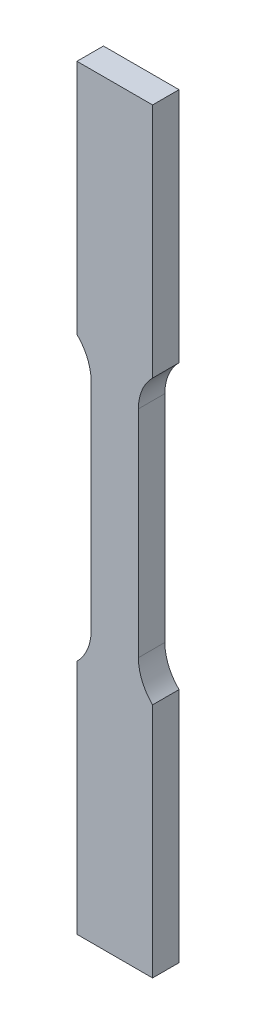
ISO-10303-21;
HEADER;
FILE_DESCRIPTION(('STEP AP214'),'2;1');
FILE_NAME('part.step','',(''),(''),'','','');
FILE_SCHEMA(('AUTOMOTIVE_DESIGN { 1 0 10303 214 1 1 1 1 }'));
ENDSEC;
DATA;
#1=APPLICATION_CONTEXT('core data for automotive mechanical design processes');
#2=APPLICATION_PROTOCOL_DEFINITION('international standard','automotive_design',2000,#1);
#3=PRODUCT_CONTEXT('',#1,'mechanical');
#4=PRODUCT('Part','Part','',(#3));
#5=PRODUCT_RELATED_PRODUCT_CATEGORY('part','',(#4));
#6=PRODUCT_DEFINITION_FORMATION('','',#4);
#7=PRODUCT_DEFINITION_CONTEXT('part definition',#1,'design');
#8=PRODUCT_DEFINITION('design','',#6,#7);
#9=PRODUCT_DEFINITION_SHAPE('','',#8);
#10=(LENGTH_UNIT() NAMED_UNIT(*) SI_UNIT(.MILLI.,.METRE.));
#11=(NAMED_UNIT(*) PLANE_ANGLE_UNIT() SI_UNIT($,.RADIAN.));
#12=(NAMED_UNIT(*) SI_UNIT($,.STERADIAN.) SOLID_ANGLE_UNIT());
#13=UNCERTAINTY_MEASURE_WITH_UNIT(LENGTH_MEASURE(1.E-05),#10,'distance_accuracy_value','');
#14=(GEOMETRIC_REPRESENTATION_CONTEXT(3) GLOBAL_UNCERTAINTY_ASSIGNED_CONTEXT((#13)) GLOBAL_UNIT_ASSIGNED_CONTEXT((#10,
#11,#12)) REPRESENTATION_CONTEXT('',''));
#15=CARTESIAN_POINT('',(0.,0.,0.));
#16=DIRECTION('',(0.,0.,1.));
#17=DIRECTION('',(1.,0.,0.));
#18=AXIS2_PLACEMENT_3D('',#15,#16,#17);
#19=CARTESIAN_POINT('',(0.,0.,3.499999985));
#20=DIRECTION('',(0.,0.,-1.));
#21=DIRECTION('',(-1.,0.,0.));
#22=AXIS2_PLACEMENT_3D('',#19,#20,#21);
#23=PLANE('',#22);
#24=CARTESIAN_POINT('',(18.7499998379998,-28.5000000230001,3.499999985));
#25=DIRECTION('',(0.,0.,1.));
#26=DIRECTION('',(1.,0.,0.));
#27=AXIS2_PLACEMENT_3D('',#24,#25,#26);
#28=CIRCLE('',#27,12.499999892);
#29=CARTESIAN_POINT('',(9.999999939,-37.4267855064484,3.499999985));
#30=VERTEX_POINT('',#29);
#31=CARTESIAN_POINT('',(6.24999994599992,-28.500000023,3.499999985));
#32=VERTEX_POINT('',#31);
#33=EDGE_CURVE('E190',#30,#32,#28,.F.);
#34=ORIENTED_EDGE('',*,*,#33,.T.);
#35=DIRECTION('',(0.,1.,0.));
#36=VECTOR('',#35,1.);
#37=CARTESIAN_POINT('',(6.249999946,0.,3.499999985));
#38=LINE('',#37,#36);
#39=CARTESIAN_POINT('',(6.249999946,28.500000023,3.499999985));
#40=VERTEX_POINT('',#39);
#41=EDGE_CURVE('E137',#32,#40,#38,.T.);
#42=ORIENTED_EDGE('',*,*,#41,.T.);
#43=CARTESIAN_POINT('',(18.749999838,28.500000023,3.499999985));
#44=DIRECTION('',(0.,0.,1.));
#45=DIRECTION('',(1.,0.,0.));
#46=AXIS2_PLACEMENT_3D('',#43,#44,#45);
#47=CIRCLE('',#46,12.499999892);
#48=CARTESIAN_POINT('',(9.999999939,37.4267855064481,3.499999985));
#49=VERTEX_POINT('',#48);
#50=EDGE_CURVE('E125',#49,#40,#47,.T.);
#51=ORIENTED_EDGE('',*,*,#50,.F.);
#52=DIRECTION('',(0.,1.,0.));
#53=VECTOR('',#52,1.);
#54=CARTESIAN_POINT('',(9.999999939,-100.000000025,3.499999985));
#55=LINE('',#54,#53);
#56=CARTESIAN_POINT('',(9.999999939,100.000000025,3.499999985));
#57=VERTEX_POINT('',#56);
#58=EDGE_CURVE('E134',#49,#57,#55,.T.);
#59=ORIENTED_EDGE('',*,*,#58,.T.);
#60=DIRECTION('',(-1.,0.,0.));
#61=VECTOR('',#60,1.);
#62=CARTESIAN_POINT('',(-9.999999939,100.000000025,3.499999985));
#63=LINE('',#62,#61);
#64=CARTESIAN_POINT('',(-9.999999939,100.000000025,3.499999985));
#65=VERTEX_POINT('',#64);
#66=EDGE_CURVE('E146',#57,#65,#63,.T.);
#67=ORIENTED_EDGE('',*,*,#66,.T.);
#68=DIRECTION('',(0.,-1.,0.));
#69=VECTOR('',#68,1.);
#70=CARTESIAN_POINT('',(-9.999999939,-100.000000025,3.499999985));
#71=LINE('',#70,#69);
#72=CARTESIAN_POINT('',(-9.999999939,37.426785506448,3.499999985));
#73=VERTEX_POINT('',#72);
#74=EDGE_CURVE('E155',#65,#73,#71,.T.);
#75=ORIENTED_EDGE('',*,*,#74,.T.);
#76=CARTESIAN_POINT('',(-18.749999838,28.5000000229999,3.499999985));
#77=DIRECTION('',(0.,0.,1.));
#78=DIRECTION('',(1.,0.,0.));
#79=AXIS2_PLACEMENT_3D('',#76,#77,#78);
#80=CIRCLE('',#79,12.499999892);
#81=CARTESIAN_POINT('',(-6.24999994599999,28.500000023,3.499999985));
#82=VERTEX_POINT('',#81);
#83=EDGE_CURVE('E197',#73,#82,#80,.F.);
#84=ORIENTED_EDGE('',*,*,#83,.T.);
#85=DIRECTION('',(0.,1.,0.));
#86=VECTOR('',#85,1.);
#87=CARTESIAN_POINT('',(-6.249999946,0.,3.499999985));
#88=LINE('',#87,#86);
#89=CARTESIAN_POINT('',(-6.24999994599992,-28.500000023,3.499999985));
#90=VERTEX_POINT('',#89);
#91=EDGE_CURVE('E217',#90,#82,#88,.T.);
#92=ORIENTED_EDGE('',*,*,#91,.F.);
#93=CARTESIAN_POINT('',(-18.7499998379998,-28.5000000230002,3.499999985));
#94=DIRECTION('',(0.,0.,1.));
#95=DIRECTION('',(1.,0.,0.));
#96=AXIS2_PLACEMENT_3D('',#93,#94,#95);
#97=CIRCLE('',#96,12.499999892);
#98=CARTESIAN_POINT('',(-9.999999939,-37.4267855064484,3.499999985));
#99=VERTEX_POINT('',#98);
#100=EDGE_CURVE('E222',#99,#90,#97,.T.);
#101=ORIENTED_EDGE('',*,*,#100,.F.);
#102=CARTESIAN_POINT('',(-9.999999939,-100.000000025,3.499999985));
#103=VERTEX_POINT('',#102);
#104=EDGE_CURVE('E154',#99,#103,#71,.T.);
#105=ORIENTED_EDGE('',*,*,#104,.T.);
#106=DIRECTION('',(1.,0.,0.));
#107=VECTOR('',#106,1.);
#108=CARTESIAN_POINT('',(-9.999999939,-100.000000025,3.499999985));
#109=LINE('',#108,#107);
#110=CARTESIAN_POINT('',(9.999999939,-100.000000025,3.499999985));
#111=VERTEX_POINT('',#110);
#112=EDGE_CURVE('E158',#103,#111,#109,.T.);
#113=ORIENTED_EDGE('',*,*,#112,.T.);
#114=EDGE_CURVE('E142',#111,#30,#55,.T.);
#115=ORIENTED_EDGE('',*,*,#114,.T.);
#116=EDGE_LOOP('',(#34,#42,#51,#59,#67,#75,#84,#92,#101,#105,#113,#115));
#117=FACE_BOUND('',#116,.T.);
#118=ADVANCED_FACE('F34',(#117),#23,.F.);
#119=CARTESIAN_POINT('',(0.,0.,-3.499999985));
#120=DIRECTION('',(0.,0.,-1.));
#121=DIRECTION('',(-1.,0.,0.));
#122=AXIS2_PLACEMENT_3D('',#119,#120,#121);
#123=PLANE('',#122);
#124=DIRECTION('',(0.,-1.,0.));
#125=VECTOR('',#124,1.);
#126=CARTESIAN_POINT('',(6.249999946,0.,-3.499999985));
#127=LINE('',#126,#125);
#128=CARTESIAN_POINT('',(6.249999946,28.500000023,-3.499999985));
#129=VERTEX_POINT('',#128);
#130=CARTESIAN_POINT('',(6.24999994599992,-28.500000023,-3.499999985));
#131=VERTEX_POINT('',#130);
#132=EDGE_CURVE('E11',#129,#131,#127,.T.);
#133=ORIENTED_EDGE('',*,*,#132,.T.);
#134=CARTESIAN_POINT('',(18.7499998379998,-28.5000000230001,-3.499999985));
#135=DIRECTION('',(0.,0.,-1.));
#136=DIRECTION('',(-1.,0.,0.));
#137=AXIS2_PLACEMENT_3D('',#134,#135,#136);
#138=CIRCLE('',#137,12.499999892);
#139=CARTESIAN_POINT('',(9.999999939,-37.4267855064484,-3.499999985));
#140=VERTEX_POINT('',#139);
#141=EDGE_CURVE('E188',#131,#140,#138,.F.);
#142=ORIENTED_EDGE('',*,*,#141,.T.);
#143=DIRECTION('',(0.,1.,0.));
#144=VECTOR('',#143,1.);
#145=CARTESIAN_POINT('',(9.999999939,-100.000000025,-3.499999985));
#146=LINE('',#145,#144);
#147=CARTESIAN_POINT('',(9.999999939,-100.000000025,-3.499999985));
#148=VERTEX_POINT('',#147);
#149=EDGE_CURVE('E161',#148,#140,#146,.T.);
#150=ORIENTED_EDGE('',*,*,#149,.F.);
#151=DIRECTION('',(1.,0.,0.));
#152=VECTOR('',#151,1.);
#153=CARTESIAN_POINT('',(-9.999999939,-100.000000025,-3.499999985));
#154=LINE('',#153,#152);
#155=CARTESIAN_POINT('',(-9.999999939,-100.000000025,-3.499999985));
#156=VERTEX_POINT('',#155);
#157=EDGE_CURVE('E143',#156,#148,#154,.T.);
#158=ORIENTED_EDGE('',*,*,#157,.F.);
#159=DIRECTION('',(0.,-1.,0.));
#160=VECTOR('',#159,1.);
#161=CARTESIAN_POINT('',(-9.999999939,-100.000000025,-3.499999985));
#162=LINE('',#161,#160);
#163=CARTESIAN_POINT('',(-9.999999939,-37.4267855064484,-3.499999985));
#164=VERTEX_POINT('',#163);
#165=EDGE_CURVE('E167',#164,#156,#162,.T.);
#166=ORIENTED_EDGE('',*,*,#165,.F.);
#167=CARTESIAN_POINT('',(-18.7499998379998,-28.5000000230002,-3.499999985));
#168=DIRECTION('',(0.,0.,-1.));
#169=DIRECTION('',(-1.,0.,0.));
#170=AXIS2_PLACEMENT_3D('',#167,#168,#169);
#171=CIRCLE('',#170,12.499999892);
#172=CARTESIAN_POINT('',(-6.24999994599983,-28.500000023,-3.499999985));
#173=VERTEX_POINT('',#172);
#174=EDGE_CURVE('E179',#173,#164,#171,.T.);
#175=ORIENTED_EDGE('',*,*,#174,.F.);
#176=DIRECTION('',(0.,-1.,0.));
#177=VECTOR('',#176,1.);
#178=CARTESIAN_POINT('',(-6.249999946,0.,-3.499999985));
#179=LINE('',#178,#177);
#180=CARTESIAN_POINT('',(-6.24999994599999,28.500000023,-3.499999985));
#181=VERTEX_POINT('',#180);
#182=EDGE_CURVE('E181',#181,#173,#179,.T.);
#183=ORIENTED_EDGE('',*,*,#182,.F.);
#184=CARTESIAN_POINT('',(-18.749999838,28.5000000229999,-3.499999985));
#185=DIRECTION('',(0.,0.,-1.));
#186=DIRECTION('',(-1.,0.,0.));
#187=AXIS2_PLACEMENT_3D('',#184,#185,#186);
#188=CIRCLE('',#187,12.499999892);
#189=CARTESIAN_POINT('',(-9.999999939,37.426785506448,-3.499999985));
#190=VERTEX_POINT('',#189);
#191=EDGE_CURVE('E130',#181,#190,#188,.F.);
#192=ORIENTED_EDGE('',*,*,#191,.T.);
#193=CARTESIAN_POINT('',(-9.999999939,100.000000025,-3.499999985));
#194=VERTEX_POINT('',#193);
#195=EDGE_CURVE('E147',#194,#190,#162,.T.);
#196=ORIENTED_EDGE('',*,*,#195,.F.);
#197=DIRECTION('',(-1.,0.,0.));
#198=VECTOR('',#197,1.);
#199=CARTESIAN_POINT('',(-9.999999939,100.000000025,-3.499999985));
#200=LINE('',#199,#198);
#201=CARTESIAN_POINT('',(9.999999939,100.000000025,-3.499999985));
#202=VERTEX_POINT('',#201);
#203=EDGE_CURVE('E164',#202,#194,#200,.T.);
#204=ORIENTED_EDGE('',*,*,#203,.F.);
#205=CARTESIAN_POINT('',(9.999999939,37.4267855064481,-3.499999985));
#206=VERTEX_POINT('',#205);
#207=EDGE_CURVE('E165',#206,#202,#146,.T.);
#208=ORIENTED_EDGE('',*,*,#207,.F.);
#209=CARTESIAN_POINT('',(18.749999838,28.500000023,-3.499999985));
#210=DIRECTION('',(0.,0.,-1.));
#211=DIRECTION('',(-1.,0.,0.));
#212=AXIS2_PLACEMENT_3D('',#209,#210,#211);
#213=CIRCLE('',#212,12.499999892);
#214=EDGE_CURVE('E49',#129,#206,#213,.T.);
#215=ORIENTED_EDGE('',*,*,#214,.F.);
#216=EDGE_LOOP('',(#133,#142,#150,#158,#166,#175,#183,#192,#196,#204,#208,#215));
#217=FACE_BOUND('',#216,.T.);
#218=ADVANCED_FACE('F195',(#217),#123,.T.);
#219=CARTESIAN_POINT('',(9.999999939,-100.000000025,3.499999985));
#220=DIRECTION('',(-1.,0.,0.));
#221=DIRECTION('',(0.,0.,1.));
#222=AXIS2_PLACEMENT_3D('',#219,#220,#221);
#223=PLANE('',#222);
#224=DIRECTION('',(0.,0.,1.));
#225=VECTOR('',#224,1.);
#226=CARTESIAN_POINT('',(9.99999993900001,-37.4267855064484,-3.612000015));
#227=LINE('',#226,#225);
#228=EDGE_CURVE('E42',#30,#140,#227,.F.);
#229=ORIENTED_EDGE('',*,*,#228,.F.);
#230=ORIENTED_EDGE('',*,*,#114,.F.);
#231=DIRECTION('',(0.,0.,-1.));
#232=VECTOR('',#231,1.);
#233=CARTESIAN_POINT('',(9.999999939,-100.000000025,3.499999985));
#234=LINE('',#233,#232);
#235=EDGE_CURVE('E160',#111,#148,#234,.T.);
#236=ORIENTED_EDGE('',*,*,#235,.T.);
#237=ORIENTED_EDGE('',*,*,#149,.T.);
#238=EDGE_LOOP('',(#229,#230,#236,#237));
#239=FACE_BOUND('',#238,.T.);
#240=ADVANCED_FACE('F199',(#239),#223,.F.);
#241=CARTESIAN_POINT('',(-9.999999939,-100.000000025,3.499999985));
#242=DIRECTION('',(1.,0.,0.));
#243=DIRECTION('',(0.,0.,-1.));
#244=AXIS2_PLACEMENT_3D('',#241,#242,#243);
#245=PLANE('',#244);
#246=DIRECTION('',(0.,0.,1.));
#247=VECTOR('',#246,1.);
#248=CARTESIAN_POINT('',(-9.999999939,37.426785506448,-3.612000015));
#249=LINE('',#248,#247);
#250=EDGE_CURVE('E151',#190,#73,#249,.T.);
#251=ORIENTED_EDGE('',*,*,#250,.T.);
#252=ORIENTED_EDGE('',*,*,#74,.F.);
#253=DIRECTION('',(0.,0.,-1.));
#254=VECTOR('',#253,1.);
#255=CARTESIAN_POINT('',(-9.999999939,100.000000025,3.499999985));
#256=LINE('',#255,#254);
#257=EDGE_CURVE('E175',#65,#194,#256,.T.);
#258=ORIENTED_EDGE('',*,*,#257,.T.);
#259=ORIENTED_EDGE('',*,*,#195,.T.);
#260=EDGE_LOOP('',(#251,#252,#258,#259));
#261=FACE_BOUND('',#260,.T.);
#262=ADVANCED_FACE('F258',(#261),#245,.F.);
#263=ORIENTED_EDGE('',*,*,#58,.F.);
#264=DIRECTION('',(0.,0.,1.));
#265=VECTOR('',#264,1.);
#266=CARTESIAN_POINT('',(9.99999993900001,37.4267855064481,-3.612000015));
#267=LINE('',#266,#265);
#268=EDGE_CURVE('E122',#49,#206,#267,.F.);
#269=ORIENTED_EDGE('',*,*,#268,.T.);
#270=ORIENTED_EDGE('',*,*,#207,.T.);
#271=DIRECTION('',(0.,0.,-1.));
#272=VECTOR('',#271,1.);
#273=CARTESIAN_POINT('',(9.999999939,100.000000025,3.499999985));
#274=LINE('',#273,#272);
#275=EDGE_CURVE('E141',#57,#202,#274,.T.);
#276=ORIENTED_EDGE('',*,*,#275,.F.);
#277=EDGE_LOOP('',(#263,#269,#270,#276));
#278=FACE_BOUND('',#277,.T.);
#279=ADVANCED_FACE('F36',(#278),#223,.F.);
#280=CARTESIAN_POINT('',(-9.999999939,100.000000025,3.499999985));
#281=DIRECTION('',(0.,-1.,0.));
#282=DIRECTION('',(0.,0.,-1.));
#283=AXIS2_PLACEMENT_3D('',#280,#281,#282);
#284=PLANE('',#283);
#285=ORIENTED_EDGE('',*,*,#203,.T.);
#286=ORIENTED_EDGE('',*,*,#257,.F.);
#287=ORIENTED_EDGE('',*,*,#66,.F.);
#288=ORIENTED_EDGE('',*,*,#275,.T.);
#289=EDGE_LOOP('',(#285,#286,#287,#288));
#290=FACE_BOUND('',#289,.T.);
#291=ADVANCED_FACE('F257',(#290),#284,.F.);
#292=ORIENTED_EDGE('',*,*,#104,.F.);
#293=DIRECTION('',(0.,0.,1.));
#294=VECTOR('',#293,1.);
#295=CARTESIAN_POINT('',(-9.999999939,-37.4267855064484,-3.612000015));
#296=LINE('',#295,#294);
#297=EDGE_CURVE('E212',#164,#99,#296,.T.);
#298=ORIENTED_EDGE('',*,*,#297,.F.);
#299=ORIENTED_EDGE('',*,*,#165,.T.);
#300=DIRECTION('',(0.,0.,-1.));
#301=VECTOR('',#300,1.);
#302=CARTESIAN_POINT('',(-9.999999939,-100.000000025,3.499999985));
#303=LINE('',#302,#301);
#304=EDGE_CURVE('E172',#103,#156,#303,.T.);
#305=ORIENTED_EDGE('',*,*,#304,.F.);
#306=EDGE_LOOP('',(#292,#298,#299,#305));
#307=FACE_BOUND('',#306,.T.);
#308=ADVANCED_FACE('F211',(#307),#245,.F.);
#309=CARTESIAN_POINT('',(-9.999999939,-100.000000025,3.499999985));
#310=DIRECTION('',(0.,1.,0.));
#311=DIRECTION('',(0.,0.,1.));
#312=AXIS2_PLACEMENT_3D('',#309,#310,#311);
#313=PLANE('',#312);
#314=ORIENTED_EDGE('',*,*,#157,.T.);
#315=ORIENTED_EDGE('',*,*,#235,.F.);
#316=ORIENTED_EDGE('',*,*,#112,.F.);
#317=ORIENTED_EDGE('',*,*,#304,.T.);
#318=EDGE_LOOP('',(#314,#315,#316,#317));
#319=FACE_BOUND('',#318,.T.);
#320=ADVANCED_FACE('F203',(#319),#313,.F.);
#321=CARTESIAN_POINT('',(-18.749999838,28.5000000229999,-3.612000015));
#322=DIRECTION('',(0.,0.,1.));
#323=DIRECTION('',(1.,0.,0.));
#324=AXIS2_PLACEMENT_3D('',#321,#322,#323);
#325=CYLINDRICAL_SURFACE('',#324,12.499999892);
#326=DIRECTION('',(0.,0.,1.));
#327=VECTOR('',#326,1.);
#328=CARTESIAN_POINT('',(-6.24999994599999,28.500000023,-3.612000015));
#329=LINE('',#328,#327);
#330=EDGE_CURVE('E214',#181,#82,#329,.T.);
#331=ORIENTED_EDGE('',*,*,#330,.T.);
#332=ORIENTED_EDGE('',*,*,#83,.F.);
#333=ORIENTED_EDGE('',*,*,#250,.F.);
#334=ORIENTED_EDGE('',*,*,#191,.F.);
#335=EDGE_LOOP('',(#331,#332,#333,#334));
#336=FACE_BOUND('',#335,.T.);
#337=ADVANCED_FACE('F243',(#336),#325,.F.);
#338=CARTESIAN_POINT('',(-6.249999946,0.,-3.612000015));
#339=DIRECTION('',(1.,0.,0.));
#340=DIRECTION('',(0.,0.,-1.));
#341=AXIS2_PLACEMENT_3D('',#338,#339,#340);
#342=PLANE('',#341);
#343=ORIENTED_EDGE('',*,*,#182,.T.);
#344=DIRECTION('',(0.,0.,1.));
#345=VECTOR('',#344,1.);
#346=CARTESIAN_POINT('',(-6.24999994599992,-28.500000023,-3.612000015));
#347=LINE('',#346,#345);
#348=EDGE_CURVE('E57',#173,#90,#347,.T.);
#349=ORIENTED_EDGE('',*,*,#348,.T.);
#350=ORIENTED_EDGE('',*,*,#91,.T.);
#351=ORIENTED_EDGE('',*,*,#330,.F.);
#352=EDGE_LOOP('',(#343,#349,#350,#351));
#353=FACE_BOUND('',#352,.T.);
#354=ADVANCED_FACE('F235',(#353),#342,.F.);
#355=CARTESIAN_POINT('',(-18.7499998379998,-28.5000000230002,-3.612000015));
#356=DIRECTION('',(0.,0.,1.));
#357=DIRECTION('',(1.,0.,0.));
#358=AXIS2_PLACEMENT_3D('',#355,#356,#357);
#359=CYLINDRICAL_SURFACE('',#358,12.499999892);
#360=ORIENTED_EDGE('',*,*,#174,.T.);
#361=ORIENTED_EDGE('',*,*,#297,.T.);
#362=ORIENTED_EDGE('',*,*,#100,.T.);
#363=ORIENTED_EDGE('',*,*,#348,.F.);
#364=EDGE_LOOP('',(#360,#361,#362,#363));
#365=FACE_BOUND('',#364,.T.);
#366=ADVANCED_FACE('F233',(#365),#359,.F.);
#367=CARTESIAN_POINT('',(18.7499998379998,-28.5000000230001,-3.612000015));
#368=DIRECTION('',(0.,0.,1.));
#369=DIRECTION('',(1.,0.,0.));
#370=AXIS2_PLACEMENT_3D('',#367,#368,#369);
#371=CYLINDRICAL_SURFACE('',#370,12.499999892);
#372=DIRECTION('',(0.,0.,1.));
#373=VECTOR('',#372,1.);
#374=CARTESIAN_POINT('',(6.24999994599992,-28.500000023,-3.612000015));
#375=LINE('',#374,#373);
#376=EDGE_CURVE('E227',#131,#32,#375,.T.);
#377=ORIENTED_EDGE('',*,*,#376,.T.);
#378=ORIENTED_EDGE('',*,*,#33,.F.);
#379=ORIENTED_EDGE('',*,*,#228,.T.);
#380=ORIENTED_EDGE('',*,*,#141,.F.);
#381=EDGE_LOOP('',(#377,#378,#379,#380));
#382=FACE_BOUND('',#381,.T.);
#383=ADVANCED_FACE('F187',(#382),#371,.F.);
#384=CARTESIAN_POINT('',(6.249999946,0.,-3.612000015));
#385=DIRECTION('',(1.,0.,0.));
#386=DIRECTION('',(0.,0.,-1.));
#387=AXIS2_PLACEMENT_3D('',#384,#385,#386);
#388=PLANE('',#387);
#389=DIRECTION('',(0.,0.,1.));
#390=VECTOR('',#389,1.);
#391=CARTESIAN_POINT('',(6.249999946,28.500000023,-3.612000015));
#392=LINE('',#391,#390);
#393=EDGE_CURVE('E228',#129,#40,#392,.T.);
#394=ORIENTED_EDGE('',*,*,#393,.T.);
#395=ORIENTED_EDGE('',*,*,#41,.F.);
#396=ORIENTED_EDGE('',*,*,#376,.F.);
#397=ORIENTED_EDGE('',*,*,#132,.F.);
#398=EDGE_LOOP('',(#394,#395,#396,#397));
#399=FACE_BOUND('',#398,.T.);
#400=ADVANCED_FACE('F241',(#399),#388,.T.);
#401=CARTESIAN_POINT('',(18.749999838,28.500000023,-3.612000015));
#402=DIRECTION('',(0.,0.,1.));
#403=DIRECTION('',(1.,0.,0.));
#404=AXIS2_PLACEMENT_3D('',#401,#402,#403);
#405=CYLINDRICAL_SURFACE('',#404,12.499999892);
#406=ORIENTED_EDGE('',*,*,#214,.T.);
#407=ORIENTED_EDGE('',*,*,#268,.F.);
#408=ORIENTED_EDGE('',*,*,#50,.T.);
#409=ORIENTED_EDGE('',*,*,#393,.F.);
#410=EDGE_LOOP('',(#406,#407,#408,#409));
#411=FACE_BOUND('',#410,.T.);
#412=ADVANCED_FACE('F124',(#411),#405,.F.);
#413=CLOSED_SHELL('',(#118,#218,#240,#262,#279,#291,#308,#320,#337,#354,#366,#383,#400,#412));
#414=MANIFOLD_SOLID_BREP('B2',#413);
#415=ADVANCED_BREP_SHAPE_REPRESENTATION('',(#18,#414),#14);
#416=SHAPE_DEFINITION_REPRESENTATION(#9,#415);
ENDSEC;
END-ISO-10303-21;
